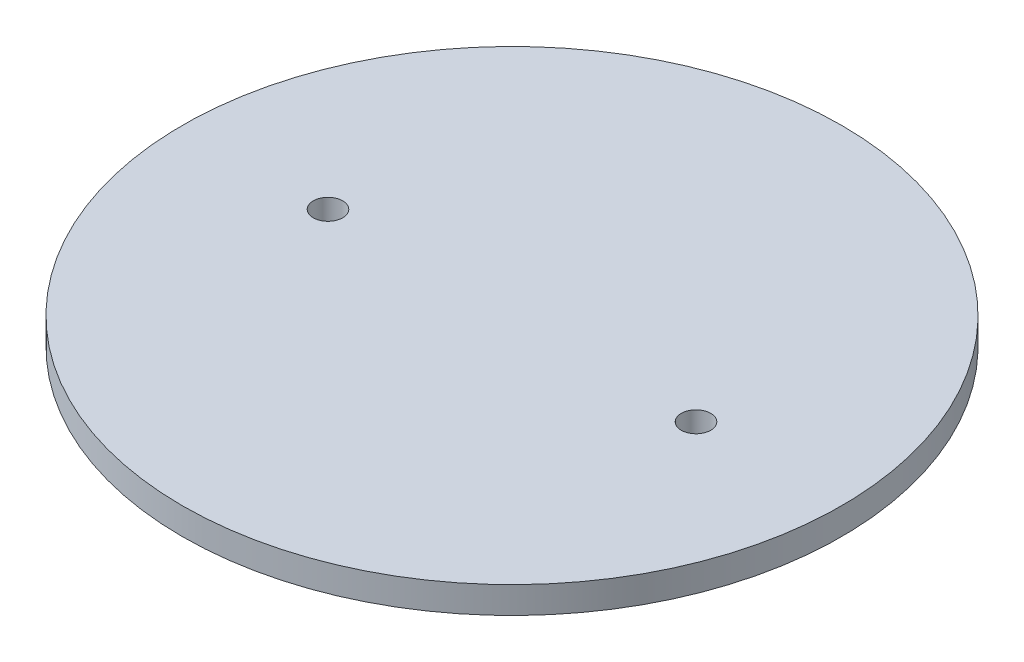
ISO-10303-21;
HEADER;
FILE_DESCRIPTION(('STEP AP214'),'2;1');
FILE_NAME('part.step','',(''),(''),'','','');
FILE_SCHEMA(('AUTOMOTIVE_DESIGN { 1 0 10303 214 1 1 1 1 }'));
ENDSEC;
DATA;
#1=APPLICATION_CONTEXT('core data for automotive mechanical design processes');
#2=APPLICATION_PROTOCOL_DEFINITION('international standard','automotive_design',2000,#1);
#3=PRODUCT_CONTEXT('',#1,'mechanical');
#4=PRODUCT('Part','Part','',(#3));
#5=PRODUCT_RELATED_PRODUCT_CATEGORY('part','',(#4));
#6=PRODUCT_DEFINITION_FORMATION('','',#4);
#7=PRODUCT_DEFINITION_CONTEXT('part definition',#1,'design');
#8=PRODUCT_DEFINITION('design','',#6,#7);
#9=PRODUCT_DEFINITION_SHAPE('','',#8);
#10=(LENGTH_UNIT() NAMED_UNIT(*) SI_UNIT(.MILLI.,.METRE.));
#11=(NAMED_UNIT(*) PLANE_ANGLE_UNIT() SI_UNIT($,.RADIAN.));
#12=(NAMED_UNIT(*) SI_UNIT($,.STERADIAN.) SOLID_ANGLE_UNIT());
#13=UNCERTAINTY_MEASURE_WITH_UNIT(LENGTH_MEASURE(1.E-05),#10,'distance_accuracy_value','');
#14=(GEOMETRIC_REPRESENTATION_CONTEXT(3) GLOBAL_UNCERTAINTY_ASSIGNED_CONTEXT((#13)) GLOBAL_UNIT_ASSIGNED_CONTEXT((#10,
#11,#12)) REPRESENTATION_CONTEXT('',''));
#15=CARTESIAN_POINT('',(0.,0.,0.));
#16=DIRECTION('',(0.,0.,1.));
#17=DIRECTION('',(1.,0.,0.));
#18=AXIS2_PLACEMENT_3D('',#15,#16,#17);
#19=CARTESIAN_POINT('',(0.,4.,0.));
#20=DIRECTION('',(0.,1.,0.));
#21=DIRECTION('',(0.,0.,1.));
#22=AXIS2_PLACEMENT_3D('',#19,#20,#21);
#23=PLANE('',#22);
#24=CARTESIAN_POINT('',(-27.5,4.,0.));
#25=DIRECTION('',(0.,1.,0.));
#26=DIRECTION('',(0.,0.,1.));
#27=AXIS2_PLACEMENT_3D('',#24,#25,#26);
#28=CIRCLE('',#27,2.2);
#29=CARTESIAN_POINT('',(-27.5,4.,2.2));
#30=VERTEX_POINT('',#29);
#31=EDGE_CURVE('E42',#30,#30,#28,.T.);
#32=ORIENTED_EDGE('',*,*,#31,.F.);
#33=EDGE_LOOP('',(#32));
#34=FACE_BOUND('',#33,.T.);
#35=CARTESIAN_POINT('',(0.,4.,0.));
#36=DIRECTION('',(0.,1.,0.));
#37=DIRECTION('',(0.,0.,1.));
#38=AXIS2_PLACEMENT_3D('',#35,#36,#37);
#39=CIRCLE('',#38,49.25);
#40=CARTESIAN_POINT('',(0.,4.,49.25));
#41=VERTEX_POINT('',#40);
#42=EDGE_CURVE('E10',#41,#41,#39,.T.);
#43=ORIENTED_EDGE('',*,*,#42,.T.);
#44=EDGE_LOOP('',(#43));
#45=FACE_BOUND('',#44,.T.);
#46=CARTESIAN_POINT('',(27.5,4.,0.));
#47=DIRECTION('',(0.,1.,0.));
#48=DIRECTION('',(0.,0.,1.));
#49=AXIS2_PLACEMENT_3D('',#46,#47,#48);
#50=CIRCLE('',#49,2.2);
#51=CARTESIAN_POINT('',(27.5,4.,2.19999999999999));
#52=VERTEX_POINT('',#51);
#53=EDGE_CURVE('E47',#52,#52,#50,.T.);
#54=ORIENTED_EDGE('',*,*,#53,.F.);
#55=EDGE_LOOP('',(#54));
#56=FACE_BOUND('',#55,.T.);
#57=ADVANCED_FACE('F31',(#34,#45,#56),#23,.T.);
#58=CARTESIAN_POINT('',(0.,0.,0.));
#59=DIRECTION('',(0.,1.,0.));
#60=DIRECTION('',(0.,0.,1.));
#61=AXIS2_PLACEMENT_3D('',#58,#59,#60);
#62=PLANE('',#61);
#63=CARTESIAN_POINT('',(0.,0.,0.));
#64=DIRECTION('',(0.,1.,0.));
#65=DIRECTION('',(0.,0.,1.));
#66=AXIS2_PLACEMENT_3D('',#63,#64,#65);
#67=CIRCLE('',#66,49.25);
#68=CARTESIAN_POINT('',(0.,0.,49.25));
#69=VERTEX_POINT('',#68);
#70=EDGE_CURVE('E35',#69,#69,#67,.T.);
#71=ORIENTED_EDGE('',*,*,#70,.F.);
#72=EDGE_LOOP('',(#71));
#73=FACE_BOUND('',#72,.T.);
#74=CARTESIAN_POINT('',(-27.5,0.,0.));
#75=DIRECTION('',(0.,1.,0.));
#76=DIRECTION('',(0.,0.,1.));
#77=AXIS2_PLACEMENT_3D('',#74,#75,#76);
#78=CIRCLE('',#77,2.2);
#79=CARTESIAN_POINT('',(-27.5,0.,2.2));
#80=VERTEX_POINT('',#79);
#81=EDGE_CURVE('E44',#80,#80,#78,.T.);
#82=ORIENTED_EDGE('',*,*,#81,.T.);
#83=EDGE_LOOP('',(#82));
#84=FACE_BOUND('',#83,.T.);
#85=CARTESIAN_POINT('',(27.5,0.,0.));
#86=DIRECTION('',(0.,1.,0.));
#87=DIRECTION('',(0.,0.,1.));
#88=AXIS2_PLACEMENT_3D('',#85,#86,#87);
#89=CIRCLE('',#88,2.2);
#90=CARTESIAN_POINT('',(27.5,0.,2.19999999999999));
#91=VERTEX_POINT('',#90);
#92=EDGE_CURVE('E50',#91,#91,#89,.T.);
#93=ORIENTED_EDGE('',*,*,#92,.T.);
#94=EDGE_LOOP('',(#93));
#95=FACE_BOUND('',#94,.T.);
#96=ADVANCED_FACE('F60',(#73,#84,#95),#62,.F.);
#97=CARTESIAN_POINT('',(0.,4.,0.));
#98=DIRECTION('',(0.,-1.,0.));
#99=DIRECTION('',(0.,0.,-1.));
#100=AXIS2_PLACEMENT_3D('',#97,#98,#99);
#101=CYLINDRICAL_SURFACE('',#100,49.25);
#102=ORIENTED_EDGE('',*,*,#42,.F.);
#103=EDGE_LOOP('',(#102));
#104=FACE_BOUND('',#103,.T.);
#105=ORIENTED_EDGE('',*,*,#70,.T.);
#106=EDGE_LOOP('',(#105));
#107=FACE_BOUND('',#106,.T.);
#108=ADVANCED_FACE('F33',(#104,#107),#101,.T.);
#109=CARTESIAN_POINT('',(-27.5,4.,0.));
#110=DIRECTION('',(0.,-1.,0.));
#111=DIRECTION('',(0.,0.,-1.));
#112=AXIS2_PLACEMENT_3D('',#109,#110,#111);
#113=CYLINDRICAL_SURFACE('',#112,2.2);
#114=ORIENTED_EDGE('',*,*,#31,.T.);
#115=EDGE_LOOP('',(#114));
#116=FACE_BOUND('',#115,.T.);
#117=ORIENTED_EDGE('',*,*,#81,.F.);
#118=EDGE_LOOP('',(#117));
#119=FACE_BOUND('',#118,.T.);
#120=ADVANCED_FACE('F69',(#116,#119),#113,.F.);
#121=CARTESIAN_POINT('',(27.5,4.,0.));
#122=DIRECTION('',(0.,-1.,0.));
#123=DIRECTION('',(0.,0.,-1.));
#124=AXIS2_PLACEMENT_3D('',#121,#122,#123);
#125=CYLINDRICAL_SURFACE('',#124,2.2);
#126=ORIENTED_EDGE('',*,*,#53,.T.);
#127=EDGE_LOOP('',(#126));
#128=FACE_BOUND('',#127,.T.);
#129=ORIENTED_EDGE('',*,*,#92,.F.);
#130=EDGE_LOOP('',(#129));
#131=FACE_BOUND('',#130,.T.);
#132=ADVANCED_FACE('F56',(#128,#131),#125,.F.);
#133=CLOSED_SHELL('',(#57,#96,#108,#120,#132));
#134=MANIFOLD_SOLID_BREP('B2',#133);
#135=ADVANCED_BREP_SHAPE_REPRESENTATION('',(#18,#134),#14);
#136=SHAPE_DEFINITION_REPRESENTATION(#9,#135);
ENDSEC;
END-ISO-10303-21;
